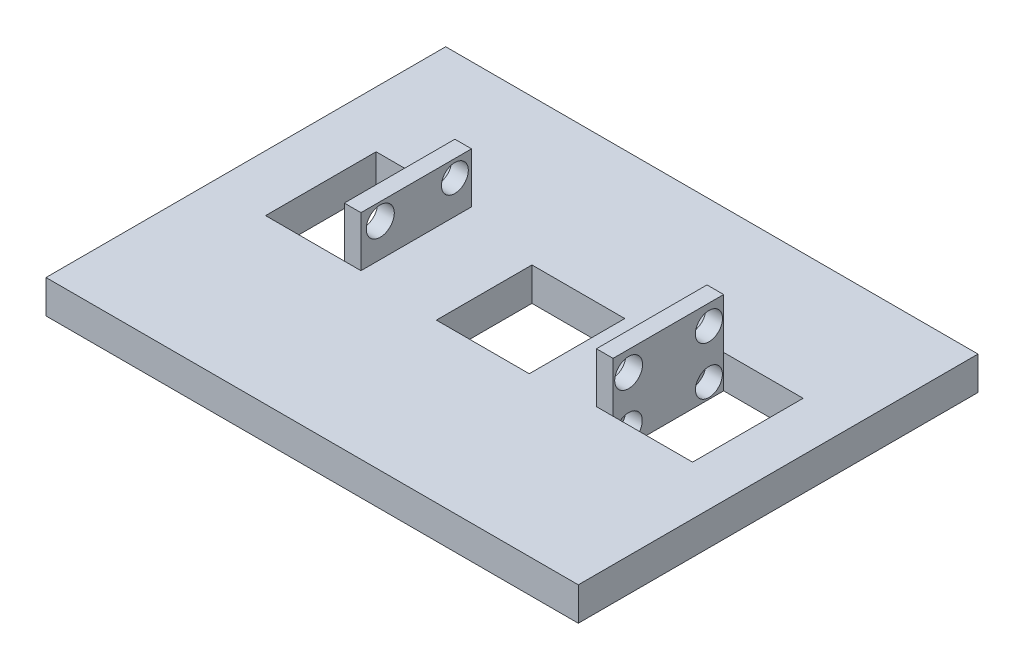
ISO-10303-21;
HEADER;
FILE_DESCRIPTION(('STEP AP214'),'2;1');
FILE_NAME('part.step','',(''),(''),'','','');
FILE_SCHEMA(('AUTOMOTIVE_DESIGN { 1 0 10303 214 1 1 1 1 }'));
ENDSEC;
DATA;
#1=APPLICATION_CONTEXT('core data for automotive mechanical design processes');
#2=APPLICATION_PROTOCOL_DEFINITION('international standard','automotive_design',2000,#1);
#3=PRODUCT_CONTEXT('',#1,'mechanical');
#4=PRODUCT('Part','Part','',(#3));
#5=PRODUCT_RELATED_PRODUCT_CATEGORY('part','',(#4));
#6=PRODUCT_DEFINITION_FORMATION('','',#4);
#7=PRODUCT_DEFINITION_CONTEXT('part definition',#1,'design');
#8=PRODUCT_DEFINITION('design','',#6,#7);
#9=PRODUCT_DEFINITION_SHAPE('','',#8);
#10=(LENGTH_UNIT() NAMED_UNIT(*) SI_UNIT(.MILLI.,.METRE.));
#11=(NAMED_UNIT(*) PLANE_ANGLE_UNIT() SI_UNIT($,.RADIAN.));
#12=(NAMED_UNIT(*) SI_UNIT($,.STERADIAN.) SOLID_ANGLE_UNIT());
#13=UNCERTAINTY_MEASURE_WITH_UNIT(LENGTH_MEASURE(1.E-05),#10,'distance_accuracy_value','');
#14=(GEOMETRIC_REPRESENTATION_CONTEXT(3) GLOBAL_UNCERTAINTY_ASSIGNED_CONTEXT((#13)) GLOBAL_UNIT_ASSIGNED_CONTEXT((#10,
#11,#12)) REPRESENTATION_CONTEXT('',''));
#15=CARTESIAN_POINT('',(0.,0.,0.));
#16=DIRECTION('',(0.,0.,1.));
#17=DIRECTION('',(1.,0.,0.));
#18=AXIS2_PLACEMENT_3D('',#15,#16,#17);
#19=CARTESIAN_POINT('',(77.3046626607348,0.,0.));
#20=DIRECTION('',(0.,0.,-1.));
#21=DIRECTION('',(-1.,0.,0.));
#22=AXIS2_PLACEMENT_3D('',#19,#20,#21);
#23=PLANE('',#22);
#24=DIRECTION('',(0.,1.,0.));
#25=VECTOR('',#24,1.);
#26=CARTESIAN_POINT('',(75.6896038656388,25.0562138380133,0.));
#27=LINE('',#26,#25);
#28=CARTESIAN_POINT('',(75.6896038656388,0.,0.));
#29=VERTEX_POINT('',#28);
#30=CARTESIAN_POINT('',(75.6896038656388,10.,0.));
#31=VERTEX_POINT('',#30);
#32=EDGE_CURVE('E193',#29,#31,#27,.T.);
#33=ORIENTED_EDGE('',*,*,#32,.F.);
#34=DIRECTION('',(1.,0.,0.));
#35=VECTOR('',#34,1.);
#36=CARTESIAN_POINT('',(77.3046626607348,0.,0.));
#37=LINE('',#36,#35);
#38=CARTESIAN_POINT('',(99.5486784733164,0.,0.));
#39=VERTEX_POINT('',#38);
#40=EDGE_CURVE('E203',#29,#39,#37,.T.);
#41=ORIENTED_EDGE('',*,*,#40,.T.);
#42=DIRECTION('',(0.,1.,0.));
#43=VECTOR('',#42,1.);
#44=CARTESIAN_POINT('',(99.5486784733164,0.,0.));
#45=LINE('',#44,#43);
#46=CARTESIAN_POINT('',(99.5486784733164,10.,0.));
#47=VERTEX_POINT('',#46);
#48=EDGE_CURVE('E222',#39,#47,#45,.T.);
#49=ORIENTED_EDGE('',*,*,#48,.T.);
#50=DIRECTION('',(-1.,0.,0.));
#51=VECTOR('',#50,1.);
#52=CARTESIAN_POINT('',(77.3046626607348,10.,0.));
#53=LINE('',#52,#51);
#54=EDGE_CURVE('E206',#47,#31,#53,.T.);
#55=ORIENTED_EDGE('',*,*,#54,.T.);
#56=EDGE_LOOP('',(#33,#41,#49,#55));
#57=FACE_BOUND('',#56,.T.);
#58=ADVANCED_FACE('F39',(#57),#23,.F.);
#59=CARTESIAN_POINT('',(99.5486784733164,0.,33.1965323237418));
#60=DIRECTION('',(0.,0.,-1.));
#61=DIRECTION('',(-1.,0.,0.));
#62=AXIS2_PLACEMENT_3D('',#59,#60,#61);
#63=PLANE('',#62);
#64=DIRECTION('',(1.,0.,0.));
#65=VECTOR('',#64,1.);
#66=CARTESIAN_POINT('',(70.6896038656388,0.,33.1965323237418));
#67=LINE('',#66,#65);
#68=CARTESIAN_POINT('',(75.6896038656388,0.,33.1965323237418));
#69=VERTEX_POINT('',#68);
#70=CARTESIAN_POINT('',(99.5486784733164,0.,33.1965323237418));
#71=VERTEX_POINT('',#70);
#72=EDGE_CURVE('E220',#69,#71,#67,.T.);
#73=ORIENTED_EDGE('',*,*,#72,.F.);
#74=DIRECTION('',(0.,1.,0.));
#75=VECTOR('',#74,1.);
#76=CARTESIAN_POINT('',(75.6896038656388,0.,33.1965323237418));
#77=LINE('',#76,#75);
#78=CARTESIAN_POINT('',(75.6896038656388,10.,33.1965323237418));
#79=VERTEX_POINT('',#78);
#80=EDGE_CURVE('E11',#69,#79,#77,.T.);
#81=ORIENTED_EDGE('',*,*,#80,.T.);
#82=DIRECTION('',(-1.,0.,0.));
#83=VECTOR('',#82,1.);
#84=CARTESIAN_POINT('',(99.5486784733164,10.,33.1965323237418));
#85=LINE('',#84,#83);
#86=CARTESIAN_POINT('',(99.5486784733164,10.,33.1965323237418));
#87=VERTEX_POINT('',#86);
#88=EDGE_CURVE('E613',#87,#79,#85,.T.);
#89=ORIENTED_EDGE('',*,*,#88,.F.);
#90=DIRECTION('',(0.,1.,0.));
#91=VECTOR('',#90,1.);
#92=CARTESIAN_POINT('',(99.5486784733164,0.,33.1965323237418));
#93=LINE('',#92,#91);
#94=EDGE_CURVE('E216',#71,#87,#93,.T.);
#95=ORIENTED_EDGE('',*,*,#94,.F.);
#96=EDGE_LOOP('',(#73,#81,#89,#95));
#97=FACE_BOUND('',#96,.T.);
#98=ADVANCED_FACE('F349',(#97),#63,.T.);
#99=CARTESIAN_POINT('',(0.,0.,0.));
#100=DIRECTION('',(0.,0.,-1.));
#101=DIRECTION('',(-1.,0.,0.));
#102=AXIS2_PLACEMENT_3D('',#99,#100,#101);
#103=PLANE('',#102);
#104=DIRECTION('',(0.,-1.,0.));
#105=VECTOR('',#104,1.);
#106=CARTESIAN_POINT('',(-5.,0.,0.));
#107=LINE('',#106,#105);
#108=CARTESIAN_POINT('',(-5.,10.,0.));
#109=VERTEX_POINT('',#108);
#110=CARTESIAN_POINT('',(-5.,0.,0.));
#111=VERTEX_POINT('',#110);
#112=EDGE_CURVE('E553',#109,#111,#107,.T.);
#113=ORIENTED_EDGE('',*,*,#112,.F.);
#114=DIRECTION('',(-1.,0.,0.));
#115=VECTOR('',#114,1.);
#116=CARTESIAN_POINT('',(0.,10.,0.));
#117=LINE('',#116,#115);
#118=CARTESIAN_POINT('',(-28.6462641466174,10.,0.));
#119=VERTEX_POINT('',#118);
#120=EDGE_CURVE('E590',#109,#119,#117,.T.);
#121=ORIENTED_EDGE('',*,*,#120,.T.);
#122=DIRECTION('',(0.,1.,0.));
#123=VECTOR('',#122,1.);
#124=CARTESIAN_POINT('',(-28.6462641466174,0.,0.));
#125=LINE('',#124,#123);
#126=CARTESIAN_POINT('',(-28.6462641466174,0.,0.));
#127=VERTEX_POINT('',#126);
#128=EDGE_CURVE('E236',#127,#119,#125,.T.);
#129=ORIENTED_EDGE('',*,*,#128,.F.);
#130=DIRECTION('',(1.,0.,0.));
#131=VECTOR('',#130,1.);
#132=CARTESIAN_POINT('',(-28.6462641466174,0.,0.));
#133=LINE('',#132,#131);
#134=EDGE_CURVE('E577',#127,#111,#133,.T.);
#135=ORIENTED_EDGE('',*,*,#134,.T.);
#136=EDGE_LOOP('',(#113,#121,#129,#135));
#137=FACE_BOUND('',#136,.T.);
#138=ADVANCED_FACE('F353',(#137),#103,.F.);
#139=CARTESIAN_POINT('',(-6.40351999211286,0.,33.1965323237418));
#140=DIRECTION('',(0.,0.,-1.));
#141=DIRECTION('',(-1.,0.,0.));
#142=AXIS2_PLACEMENT_3D('',#139,#140,#141);
#143=PLANE('',#142);
#144=DIRECTION('',(-1.,0.,0.));
#145=VECTOR('',#144,1.);
#146=CARTESIAN_POINT('',(-6.40351999211286,10.,33.1965323237418));
#147=LINE('',#146,#145);
#148=CARTESIAN_POINT('',(-5.,10.,33.1965323237418));
#149=VERTEX_POINT('',#148);
#150=CARTESIAN_POINT('',(-28.6462641466174,10.,33.1965323237418));
#151=VERTEX_POINT('',#150);
#152=EDGE_CURVE('E63',#149,#151,#147,.T.);
#153=ORIENTED_EDGE('',*,*,#152,.F.);
#154=DIRECTION('',(0.,1.,0.));
#155=VECTOR('',#154,1.);
#156=CARTESIAN_POINT('',(-5.,22.4657523322094,33.1965323237418));
#157=LINE('',#156,#155);
#158=CARTESIAN_POINT('',(-5.,0.,33.1965323237418));
#159=VERTEX_POINT('',#158);
#160=EDGE_CURVE('E546',#159,#149,#157,.T.);
#161=ORIENTED_EDGE('',*,*,#160,.F.);
#162=DIRECTION('',(1.,0.,0.));
#163=VECTOR('',#162,1.);
#164=CARTESIAN_POINT('',(-6.40351999211286,0.,33.1965323237418));
#165=LINE('',#164,#163);
#166=CARTESIAN_POINT('',(-28.6462641466174,0.,33.1965323237418));
#167=VERTEX_POINT('',#166);
#168=EDGE_CURVE('E582',#167,#159,#165,.T.);
#169=ORIENTED_EDGE('',*,*,#168,.F.);
#170=DIRECTION('',(0.,1.,0.));
#171=VECTOR('',#170,1.);
#172=CARTESIAN_POINT('',(-28.6462641466174,0.,33.1965323237418));
#173=LINE('',#172,#171);
#174=EDGE_CURVE('E586',#167,#151,#173,.T.);
#175=ORIENTED_EDGE('',*,*,#174,.T.);
#176=EDGE_LOOP('',(#153,#161,#169,#175));
#177=FACE_BOUND('',#176,.T.);
#178=ADVANCED_FACE('F368',(#177),#143,.T.);
#179=CARTESIAN_POINT('',(0.,10.,0.));
#180=DIRECTION('',(0.,1.,0.));
#181=DIRECTION('',(0.,0.,1.));
#182=AXIS2_PLACEMENT_3D('',#179,#180,#181);
#183=PLANE('',#182);
#184=DIRECTION('',(1.,0.,0.));
#185=VECTOR('',#184,1.);
#186=CARTESIAN_POINT('',(24.1652876550198,10.,6.03100491844726));
#187=LINE('',#186,#185);
#188=CARTESIAN_POINT('',(24.1652876550198,10.,6.03100491844726));
#189=VERTEX_POINT('',#188);
#190=CARTESIAN_POINT('',(52.0481990577544,10.,6.03100491844726));
#191=VERTEX_POINT('',#190);
#192=EDGE_CURVE('E244',#189,#191,#187,.T.);
#193=ORIENTED_EDGE('',*,*,#192,.T.);
#194=DIRECTION('',(0.,0.,1.));
#195=VECTOR('',#194,1.);
#196=CARTESIAN_POINT('',(52.0481990577544,10.,16.0059569402772));
#197=LINE('',#196,#195);
#198=CARTESIAN_POINT('',(52.0481990577544,10.,34.7216767180942));
#199=VERTEX_POINT('',#198);
#200=EDGE_CURVE('E231',#191,#199,#197,.T.);
#201=ORIENTED_EDGE('',*,*,#200,.T.);
#202=DIRECTION('',(-1.,0.,0.));
#203=VECTOR('',#202,1.);
#204=CARTESIAN_POINT('',(52.0481990577544,10.,34.7216767180942));
#205=LINE('',#204,#203);
#206=CARTESIAN_POINT('',(24.1652876550198,10.,34.7216767180942));
#207=VERTEX_POINT('',#206);
#208=EDGE_CURVE('E235',#199,#207,#205,.T.);
#209=ORIENTED_EDGE('',*,*,#208,.T.);
#210=DIRECTION('',(0.,0.,-1.));
#211=VECTOR('',#210,1.);
#212=CARTESIAN_POINT('',(24.1652876550198,10.,34.7216767180942));
#213=LINE('',#212,#211);
#214=EDGE_CURVE('E240',#207,#189,#213,.T.);
#215=ORIENTED_EDGE('',*,*,#214,.T.);
#216=EDGE_LOOP('',(#193,#201,#209,#215));
#217=FACE_BOUND('',#216,.T.);
#218=DIRECTION('',(0.,0.,-1.));
#219=VECTOR('',#218,1.);
#220=CARTESIAN_POINT('',(114.292682926829,10.,82.2439024390244));
#221=LINE('',#220,#219);
#222=CARTESIAN_POINT('',(114.292682926829,10.,82.2439024390244));
#223=VERTEX_POINT('',#222);
#224=CARTESIAN_POINT('',(114.292682926829,10.,-37.7560975609756));
#225=VERTEX_POINT('',#224);
#226=EDGE_CURVE('E262',#223,#225,#221,.T.);
#227=ORIENTED_EDGE('',*,*,#226,.T.);
#228=DIRECTION('',(-1.,0.,0.));
#229=VECTOR('',#228,1.);
#230=CARTESIAN_POINT('',(114.292682926829,10.,-37.7560975609756));
#231=LINE('',#230,#229);
#232=CARTESIAN_POINT('',(-45.5121951219512,10.,-37.7560975609756));
#233=VERTEX_POINT('',#232);
#234=EDGE_CURVE('E266',#225,#233,#231,.T.);
#235=ORIENTED_EDGE('',*,*,#234,.T.);
#236=DIRECTION('',(0.,0.,1.));
#237=VECTOR('',#236,1.);
#238=CARTESIAN_POINT('',(-45.5121951219512,10.,-37.7560975609756));
#239=LINE('',#238,#237);
#240=CARTESIAN_POINT('',(-45.5121951219512,10.,82.2439024390244));
#241=VERTEX_POINT('',#240);
#242=EDGE_CURVE('E270',#233,#241,#239,.T.);
#243=ORIENTED_EDGE('',*,*,#242,.T.);
#244=DIRECTION('',(1.,0.,0.));
#245=VECTOR('',#244,1.);
#246=CARTESIAN_POINT('',(-45.5121951219512,10.,82.2439024390244));
#247=LINE('',#246,#245);
#248=EDGE_CURVE('E273',#241,#223,#247,.T.);
#249=ORIENTED_EDGE('',*,*,#248,.T.);
#250=EDGE_LOOP('',(#227,#235,#243,#249));
#251=FACE_BOUND('',#250,.T.);
#252=DIRECTION('',(0.,0.,1.));
#253=VECTOR('',#252,1.);
#254=CARTESIAN_POINT('',(70.6896038656388,10.,0.));
#255=LINE('',#254,#253);
#256=CARTESIAN_POINT('',(70.6896038656388,10.,0.));
#257=VERTEX_POINT('',#256);
#258=CARTESIAN_POINT('',(70.6896038656388,10.,33.1965323237418));
#259=VERTEX_POINT('',#258);
#260=EDGE_CURVE('E225',#257,#259,#255,.T.);
#261=ORIENTED_EDGE('',*,*,#260,.F.);
#262=EDGE_CURVE('E230',#31,#257,#53,.T.);
#263=ORIENTED_EDGE('',*,*,#262,.F.);
#264=ORIENTED_EDGE('',*,*,#54,.F.);
#265=DIRECTION('',(0.,0.,1.));
#266=VECTOR('',#265,1.);
#267=CARTESIAN_POINT('',(99.5486784733164,10.,0.));
#268=LINE('',#267,#266);
#269=EDGE_CURVE('E609',#47,#87,#268,.T.);
#270=ORIENTED_EDGE('',*,*,#269,.T.);
#271=ORIENTED_EDGE('',*,*,#88,.T.);
#272=EDGE_CURVE('E612',#79,#259,#85,.T.);
#273=ORIENTED_EDGE('',*,*,#272,.T.);
#274=EDGE_LOOP('',(#261,#263,#264,#270,#271,#273));
#275=FACE_BOUND('',#274,.T.);
#276=CARTESIAN_POINT('',(0.,10.,33.1965323237418));
#277=VERTEX_POINT('',#276);
#278=EDGE_CURVE('E578',#277,#149,#147,.T.);
#279=ORIENTED_EDGE('',*,*,#278,.T.);
#280=ORIENTED_EDGE('',*,*,#152,.T.);
#281=DIRECTION('',(0.,0.,-1.));
#282=VECTOR('',#281,1.);
#283=CARTESIAN_POINT('',(-28.6462641466174,10.,33.1965323237418));
#284=LINE('',#283,#282);
#285=EDGE_CURVE('E587',#151,#119,#284,.T.);
#286=ORIENTED_EDGE('',*,*,#285,.T.);
#287=ORIENTED_EDGE('',*,*,#120,.F.);
#288=CARTESIAN_POINT('',(0.,10.,0.));
#289=VERTEX_POINT('',#288);
#290=EDGE_CURVE('E591',#289,#109,#117,.T.);
#291=ORIENTED_EDGE('',*,*,#290,.F.);
#292=DIRECTION('',(0.,0.,-1.));
#293=VECTOR('',#292,1.);
#294=CARTESIAN_POINT('',(0.,10.,33.1965323237418));
#295=LINE('',#294,#293);
#296=EDGE_CURVE('E594',#277,#289,#295,.T.);
#297=ORIENTED_EDGE('',*,*,#296,.F.);
#298=EDGE_LOOP('',(#279,#280,#286,#287,#291,#297));
#299=FACE_BOUND('',#298,.T.);
#300=ADVANCED_FACE('F332',(#217,#251,#275,#299),#183,.T.);
#301=CARTESIAN_POINT('',(0.,0.,0.));
#302=DIRECTION('',(0.,1.,0.));
#303=DIRECTION('',(0.,0.,1.));
#304=AXIS2_PLACEMENT_3D('',#301,#302,#303);
#305=PLANE('',#304);
#306=ORIENTED_EDGE('',*,*,#40,.F.);
#307=DIRECTION('',(0.,0.,-1.));
#308=VECTOR('',#307,1.);
#309=CARTESIAN_POINT('',(75.6896038656388,0.,0.));
#310=LINE('',#309,#308);
#311=EDGE_CURVE('E55',#69,#29,#310,.T.);
#312=ORIENTED_EDGE('',*,*,#311,.F.);
#313=ORIENTED_EDGE('',*,*,#72,.T.);
#314=DIRECTION('',(0.,0.,1.));
#315=VECTOR('',#314,1.);
#316=CARTESIAN_POINT('',(99.5486784733164,0.,0.));
#317=LINE('',#316,#315);
#318=EDGE_CURVE('E214',#39,#71,#317,.T.);
#319=ORIENTED_EDGE('',*,*,#318,.F.);
#320=EDGE_LOOP('',(#306,#312,#313,#319));
#321=FACE_BOUND('',#320,.T.);
#322=DIRECTION('',(0.,0.,1.));
#323=VECTOR('',#322,1.);
#324=CARTESIAN_POINT('',(-5.,0.,33.1965323237418));
#325=LINE('',#324,#323);
#326=EDGE_CURVE('E541',#111,#159,#325,.T.);
#327=ORIENTED_EDGE('',*,*,#326,.F.);
#328=ORIENTED_EDGE('',*,*,#134,.F.);
#329=DIRECTION('',(0.,0.,-1.));
#330=VECTOR('',#329,1.);
#331=CARTESIAN_POINT('',(-28.6462641466174,0.,33.1965323237418));
#332=LINE('',#331,#330);
#333=EDGE_CURVE('E574',#167,#127,#332,.T.);
#334=ORIENTED_EDGE('',*,*,#333,.F.);
#335=ORIENTED_EDGE('',*,*,#168,.T.);
#336=EDGE_LOOP('',(#327,#328,#334,#335));
#337=FACE_BOUND('',#336,.T.);
#338=DIRECTION('',(0.,0.,1.));
#339=VECTOR('',#338,1.);
#340=CARTESIAN_POINT('',(52.0481990577544,0.,0.));
#341=LINE('',#340,#339);
#342=CARTESIAN_POINT('',(52.0481990577544,0.,6.03100491844726));
#343=VERTEX_POINT('',#342);
#344=CARTESIAN_POINT('',(52.0481990577544,0.,34.7216767180942));
#345=VERTEX_POINT('',#344);
#346=EDGE_CURVE('E48',#343,#345,#341,.T.);
#347=ORIENTED_EDGE('',*,*,#346,.F.);
#348=DIRECTION('',(1.,0.,0.));
#349=VECTOR('',#348,1.);
#350=CARTESIAN_POINT('',(0.,0.,6.03100491844726));
#351=LINE('',#350,#349);
#352=CARTESIAN_POINT('',(24.1652876550198,0.,6.03100491844726));
#353=VERTEX_POINT('',#352);
#354=EDGE_CURVE('E303',#353,#343,#351,.T.);
#355=ORIENTED_EDGE('',*,*,#354,.F.);
#356=DIRECTION('',(0.,0.,-1.));
#357=VECTOR('',#356,1.);
#358=CARTESIAN_POINT('',(24.1652876550198,0.,0.));
#359=LINE('',#358,#357);
#360=CARTESIAN_POINT('',(24.1652876550198,0.,34.7216767180942));
#361=VERTEX_POINT('',#360);
#362=EDGE_CURVE('E306',#361,#353,#359,.T.);
#363=ORIENTED_EDGE('',*,*,#362,.F.);
#364=DIRECTION('',(-1.,0.,0.));
#365=VECTOR('',#364,1.);
#366=CARTESIAN_POINT('',(0.,0.,34.7216767180942));
#367=LINE('',#366,#365);
#368=EDGE_CURVE('E310',#345,#361,#367,.T.);
#369=ORIENTED_EDGE('',*,*,#368,.F.);
#370=EDGE_LOOP('',(#347,#355,#363,#369));
#371=FACE_BOUND('',#370,.T.);
#372=DIRECTION('',(0.,0.,-1.));
#373=VECTOR('',#372,1.);
#374=CARTESIAN_POINT('',(114.292682926829,0.,82.2439024390244));
#375=LINE('',#374,#373);
#376=CARTESIAN_POINT('',(114.292682926829,0.,82.2439024390244));
#377=VERTEX_POINT('',#376);
#378=CARTESIAN_POINT('',(114.292682926829,0.,-37.7560975609756));
#379=VERTEX_POINT('',#378);
#380=EDGE_CURVE('E261',#377,#379,#375,.T.);
#381=ORIENTED_EDGE('',*,*,#380,.F.);
#382=DIRECTION('',(1.,0.,0.));
#383=VECTOR('',#382,1.);
#384=CARTESIAN_POINT('',(-45.5121951219512,0.,82.2439024390244));
#385=LINE('',#384,#383);
#386=CARTESIAN_POINT('',(-45.5121951219512,0.,82.2439024390244));
#387=VERTEX_POINT('',#386);
#388=EDGE_CURVE('E267',#387,#377,#385,.T.);
#389=ORIENTED_EDGE('',*,*,#388,.F.);
#390=DIRECTION('',(0.,0.,1.));
#391=VECTOR('',#390,1.);
#392=CARTESIAN_POINT('',(-45.5121951219512,0.,-37.7560975609756));
#393=LINE('',#392,#391);
#394=CARTESIAN_POINT('',(-45.5121951219512,0.,-37.7560975609756));
#395=VERTEX_POINT('',#394);
#396=EDGE_CURVE('E283',#395,#387,#393,.T.);
#397=ORIENTED_EDGE('',*,*,#396,.F.);
#398=DIRECTION('',(-1.,0.,0.));
#399=VECTOR('',#398,1.);
#400=CARTESIAN_POINT('',(114.292682926829,0.,-37.7560975609756));
#401=LINE('',#400,#399);
#402=EDGE_CURVE('E280',#379,#395,#401,.T.);
#403=ORIENTED_EDGE('',*,*,#402,.F.);
#404=EDGE_LOOP('',(#381,#389,#397,#403));
#405=FACE_BOUND('',#404,.T.);
#406=ADVANCED_FACE('F211',(#321,#337,#371,#405),#305,.F.);
#407=CARTESIAN_POINT('',(114.292682926829,10.,82.2439024390244));
#408=DIRECTION('',(-1.,0.,0.));
#409=DIRECTION('',(0.,0.,1.));
#410=AXIS2_PLACEMENT_3D('',#407,#408,#409);
#411=PLANE('',#410);
#412=ORIENTED_EDGE('',*,*,#380,.T.);
#413=DIRECTION('',(0.,-1.,0.));
#414=VECTOR('',#413,1.);
#415=CARTESIAN_POINT('',(114.292682926829,10.,-37.7560975609756));
#416=LINE('',#415,#414);
#417=EDGE_CURVE('E299',#225,#379,#416,.T.);
#418=ORIENTED_EDGE('',*,*,#417,.F.);
#419=ORIENTED_EDGE('',*,*,#226,.F.);
#420=DIRECTION('',(0.,-1.,0.));
#421=VECTOR('',#420,1.);
#422=CARTESIAN_POINT('',(114.292682926829,10.,82.2439024390244));
#423=LINE('',#422,#421);
#424=EDGE_CURVE('E276',#223,#377,#423,.T.);
#425=ORIENTED_EDGE('',*,*,#424,.T.);
#426=EDGE_LOOP('',(#412,#418,#419,#425));
#427=FACE_BOUND('',#426,.T.);
#428=ADVANCED_FACE('F41',(#427),#411,.F.);
#429=CARTESIAN_POINT('',(114.292682926829,10.,-37.7560975609756));
#430=DIRECTION('',(0.,0.,1.));
#431=DIRECTION('',(1.,0.,0.));
#432=AXIS2_PLACEMENT_3D('',#429,#430,#431);
#433=PLANE('',#432);
#434=ORIENTED_EDGE('',*,*,#402,.T.);
#435=DIRECTION('',(0.,-1.,0.));
#436=VECTOR('',#435,1.);
#437=CARTESIAN_POINT('',(-45.5121951219512,10.,-37.7560975609756));
#438=LINE('',#437,#436);
#439=EDGE_CURVE('E295',#233,#395,#438,.T.);
#440=ORIENTED_EDGE('',*,*,#439,.F.);
#441=ORIENTED_EDGE('',*,*,#234,.F.);
#442=ORIENTED_EDGE('',*,*,#417,.T.);
#443=EDGE_LOOP('',(#434,#440,#441,#442));
#444=FACE_BOUND('',#443,.T.);
#445=ADVANCED_FACE('F678',(#444),#433,.F.);
#446=CARTESIAN_POINT('',(-45.5121951219512,10.,-37.7560975609756));
#447=DIRECTION('',(1.,0.,0.));
#448=DIRECTION('',(0.,0.,-1.));
#449=AXIS2_PLACEMENT_3D('',#446,#447,#448);
#450=PLANE('',#449);
#451=ORIENTED_EDGE('',*,*,#396,.T.);
#452=DIRECTION('',(0.,-1.,0.));
#453=VECTOR('',#452,1.);
#454=CARTESIAN_POINT('',(-45.5121951219512,10.,82.2439024390244));
#455=LINE('',#454,#453);
#456=EDGE_CURVE('E291',#241,#387,#455,.T.);
#457=ORIENTED_EDGE('',*,*,#456,.F.);
#458=ORIENTED_EDGE('',*,*,#242,.F.);
#459=ORIENTED_EDGE('',*,*,#439,.T.);
#460=EDGE_LOOP('',(#451,#457,#458,#459));
#461=FACE_BOUND('',#460,.T.);
#462=ADVANCED_FACE('F675',(#461),#450,.F.);
#463=CARTESIAN_POINT('',(-45.5121951219512,10.,82.2439024390244));
#464=DIRECTION('',(0.,0.,-1.));
#465=DIRECTION('',(-1.,0.,0.));
#466=AXIS2_PLACEMENT_3D('',#463,#464,#465);
#467=PLANE('',#466);
#468=ORIENTED_EDGE('',*,*,#388,.T.);
#469=ORIENTED_EDGE('',*,*,#424,.F.);
#470=ORIENTED_EDGE('',*,*,#248,.F.);
#471=ORIENTED_EDGE('',*,*,#456,.T.);
#472=EDGE_LOOP('',(#468,#469,#470,#471));
#473=FACE_BOUND('',#472,.T.);
#474=ADVANCED_FACE('F672',(#473),#467,.F.);
#475=CARTESIAN_POINT('',(52.0481990577544,-10.,16.0059569402772));
#476=DIRECTION('',(-1.,0.,0.));
#477=DIRECTION('',(0.,0.,1.));
#478=AXIS2_PLACEMENT_3D('',#475,#476,#477);
#479=PLANE('',#478);
#480=ORIENTED_EDGE('',*,*,#346,.T.);
#481=DIRECTION('',(0.,1.,0.));
#482=VECTOR('',#481,1.);
#483=CARTESIAN_POINT('',(52.0481990577544,-10.,34.7216767180942));
#484=LINE('',#483,#482);
#485=EDGE_CURVE('E258',#345,#199,#484,.T.);
#486=ORIENTED_EDGE('',*,*,#485,.T.);
#487=ORIENTED_EDGE('',*,*,#200,.F.);
#488=DIRECTION('',(0.,1.,0.));
#489=VECTOR('',#488,1.);
#490=CARTESIAN_POINT('',(52.0481990577544,-10.,6.03100491844726));
#491=LINE('',#490,#489);
#492=EDGE_CURVE('E248',#343,#191,#491,.T.);
#493=ORIENTED_EDGE('',*,*,#492,.F.);
#494=EDGE_LOOP('',(#480,#486,#487,#493));
#495=FACE_BOUND('',#494,.T.);
#496=ADVANCED_FACE('F317',(#495),#479,.T.);
#497=CARTESIAN_POINT('',(52.0481990577544,-10.,34.7216767180942));
#498=DIRECTION('',(0.,0.,-1.));
#499=DIRECTION('',(-1.,0.,0.));
#500=AXIS2_PLACEMENT_3D('',#497,#498,#499);
#501=PLANE('',#500);
#502=ORIENTED_EDGE('',*,*,#368,.T.);
#503=DIRECTION('',(0.,1.,0.));
#504=VECTOR('',#503,1.);
#505=CARTESIAN_POINT('',(24.1652876550198,-10.,34.7216767180942));
#506=LINE('',#505,#504);
#507=EDGE_CURVE('E255',#361,#207,#506,.T.);
#508=ORIENTED_EDGE('',*,*,#507,.T.);
#509=ORIENTED_EDGE('',*,*,#208,.F.);
#510=ORIENTED_EDGE('',*,*,#485,.F.);
#511=EDGE_LOOP('',(#502,#508,#509,#510));
#512=FACE_BOUND('',#511,.T.);
#513=ADVANCED_FACE('F323',(#512),#501,.T.);
#514=CARTESIAN_POINT('',(24.1652876550198,-10.,34.7216767180942));
#515=DIRECTION('',(1.,0.,0.));
#516=DIRECTION('',(0.,0.,-1.));
#517=AXIS2_PLACEMENT_3D('',#514,#515,#516);
#518=PLANE('',#517);
#519=ORIENTED_EDGE('',*,*,#362,.T.);
#520=DIRECTION('',(0.,1.,0.));
#521=VECTOR('',#520,1.);
#522=CARTESIAN_POINT('',(24.1652876550198,-10.,6.03100491844726));
#523=LINE('',#522,#521);
#524=EDGE_CURVE('E252',#353,#189,#523,.T.);
#525=ORIENTED_EDGE('',*,*,#524,.T.);
#526=ORIENTED_EDGE('',*,*,#214,.F.);
#527=ORIENTED_EDGE('',*,*,#507,.F.);
#528=EDGE_LOOP('',(#519,#525,#526,#527));
#529=FACE_BOUND('',#528,.T.);
#530=ADVANCED_FACE('F328',(#529),#518,.T.);
#531=CARTESIAN_POINT('',(24.1652876550198,-10.,6.03100491844726));
#532=DIRECTION('',(0.,0.,1.));
#533=DIRECTION('',(1.,0.,0.));
#534=AXIS2_PLACEMENT_3D('',#531,#532,#533);
#535=PLANE('',#534);
#536=ORIENTED_EDGE('',*,*,#354,.T.);
#537=ORIENTED_EDGE('',*,*,#492,.T.);
#538=ORIENTED_EDGE('',*,*,#192,.F.);
#539=ORIENTED_EDGE('',*,*,#524,.F.);
#540=EDGE_LOOP('',(#536,#537,#538,#539));
#541=FACE_BOUND('',#540,.T.);
#542=ADVANCED_FACE('F335',(#541),#535,.T.);
#543=CARTESIAN_POINT('',(99.5486784733164,0.,0.));
#544=DIRECTION('',(-1.,0.,0.));
#545=DIRECTION('',(0.,0.,1.));
#546=AXIS2_PLACEMENT_3D('',#543,#544,#545);
#547=PLANE('',#546);
#548=ORIENTED_EDGE('',*,*,#269,.F.);
#549=ORIENTED_EDGE('',*,*,#48,.F.);
#550=ORIENTED_EDGE('',*,*,#318,.T.);
#551=ORIENTED_EDGE('',*,*,#94,.T.);
#552=EDGE_LOOP('',(#548,#549,#550,#551));
#553=FACE_BOUND('',#552,.T.);
#554=ADVANCED_FACE('F337',(#553),#547,.T.);
#555=CARTESIAN_POINT('',(-28.6462641466174,0.,33.1965323237418));
#556=DIRECTION('',(1.,0.,0.));
#557=DIRECTION('',(0.,0.,-1.));
#558=AXIS2_PLACEMENT_3D('',#555,#556,#557);
#559=PLANE('',#558);
#560=ORIENTED_EDGE('',*,*,#285,.F.);
#561=ORIENTED_EDGE('',*,*,#174,.F.);
#562=ORIENTED_EDGE('',*,*,#333,.T.);
#563=ORIENTED_EDGE('',*,*,#128,.T.);
#564=EDGE_LOOP('',(#560,#561,#562,#563));
#565=FACE_BOUND('',#564,.T.);
#566=ADVANCED_FACE('F343',(#565),#559,.T.);
#567=CARTESIAN_POINT('',(-5.,0.,0.));
#568=DIRECTION('',(1.,0.,0.));
#569=DIRECTION('',(0.,0.,-1.));
#570=AXIS2_PLACEMENT_3D('',#567,#568,#569);
#571=PLANE('',#570);
#572=ORIENTED_EDGE('',*,*,#326,.T.);
#573=ORIENTED_EDGE('',*,*,#160,.T.);
#574=CARTESIAN_POINT('',(-5.,25.0892259815885,33.1965323237418));
#575=VERTEX_POINT('',#574);
#576=EDGE_CURVE('E544',#149,#575,#157,.T.);
#577=ORIENTED_EDGE('',*,*,#576,.T.);
#578=DIRECTION('',(0.,0.,-1.));
#579=VECTOR('',#578,1.);
#580=CARTESIAN_POINT('',(-5.,25.0892259815885,0.));
#581=LINE('',#580,#579);
#582=CARTESIAN_POINT('',(-5.,25.0892259815885,0.));
#583=VERTEX_POINT('',#582);
#584=EDGE_CURVE('E550',#575,#583,#581,.T.);
#585=ORIENTED_EDGE('',*,*,#584,.T.);
#586=EDGE_CURVE('E554',#583,#109,#107,.T.);
#587=ORIENTED_EDGE('',*,*,#586,.T.);
#588=ORIENTED_EDGE('',*,*,#112,.T.);
#589=EDGE_LOOP('',(#572,#573,#577,#585,#587,#588));
#590=FACE_BOUND('',#589,.T.);
#591=CARTESIAN_POINT('',(-5.,20.0097723265387,4.99932875840892));
#592=DIRECTION('',(-1.,0.,0.));
#593=DIRECTION('',(0.,0.,1.));
#594=AXIS2_PLACEMENT_3D('',#591,#592,#593);
#595=CIRCLE('',#594,4.02738609470973);
#596=CARTESIAN_POINT('',(-5.,20.0097723265387,9.02671485311864));
#597=VERTEX_POINT('',#596);
#598=EDGE_CURVE('E533',#597,#597,#595,.T.);
#599=ORIENTED_EDGE('',*,*,#598,.F.);
#600=EDGE_LOOP('',(#599));
#601=FACE_BOUND('',#600,.T.);
#602=CARTESIAN_POINT('',(-5.,20.0097723265387,27.4008713654246));
#603=DIRECTION('',(-1.,0.,0.));
#604=DIRECTION('',(0.,0.,1.));
#605=AXIS2_PLACEMENT_3D('',#602,#603,#604);
#606=CIRCLE('',#605,4.2056276541132);
#607=CARTESIAN_POINT('',(-5.,20.0097723265387,31.6064990195378));
#608=VERTEX_POINT('',#607);
#609=EDGE_CURVE('E525',#608,#608,#606,.T.);
#610=ORIENTED_EDGE('',*,*,#609,.F.);
#611=EDGE_LOOP('',(#610));
#612=FACE_BOUND('',#611,.T.);
#613=CARTESIAN_POINT('',(-5.,4.19367212560928,4.99932875840892));
#614=DIRECTION('',(-1.,0.,0.));
#615=DIRECTION('',(0.,0.,1.));
#616=AXIS2_PLACEMENT_3D('',#613,#614,#615);
#617=CIRCLE('',#616,4.03945698437636);
#618=CARTESIAN_POINT('',(-5.,4.19367212560928,9.03878574278528));
#619=VERTEX_POINT('',#618);
#620=EDGE_CURVE('E517',#619,#619,#617,.T.);
#621=ORIENTED_EDGE('',*,*,#620,.F.);
#622=EDGE_LOOP('',(#621));
#623=FACE_BOUND('',#622,.T.);
#624=CARTESIAN_POINT('',(-5.,4.19367212560928,27.4008713654246));
#625=DIRECTION('',(-1.,0.,0.));
#626=DIRECTION('',(0.,0.,1.));
#627=AXIS2_PLACEMENT_3D('',#624,#625,#626);
#628=CIRCLE('',#627,4.0361762375328);
#629=CARTESIAN_POINT('',(-5.,4.19367212560928,31.4370476029574));
#630=VERTEX_POINT('',#629);
#631=EDGE_CURVE('E509',#630,#630,#628,.T.);
#632=ORIENTED_EDGE('',*,*,#631,.F.);
#633=EDGE_LOOP('',(#632));
#634=FACE_BOUND('',#633,.T.);
#635=ADVANCED_FACE('F364',(#590,#601,#612,#623,#634),#571,.F.);
#636=CARTESIAN_POINT('',(0.,0.,0.));
#637=DIRECTION('',(1.,0.,0.));
#638=DIRECTION('',(0.,0.,-1.));
#639=AXIS2_PLACEMENT_3D('',#636,#637,#638);
#640=PLANE('',#639);
#641=CARTESIAN_POINT('',(0.,20.0097723265387,4.99932875840892));
#642=DIRECTION('',(-1.,0.,0.));
#643=DIRECTION('',(0.,0.,1.));
#644=AXIS2_PLACEMENT_3D('',#641,#642,#643);
#645=CIRCLE('',#644,4.02738609470973);
#646=CARTESIAN_POINT('',(0.,20.0097723265387,9.02671485311864));
#647=VERTEX_POINT('',#646);
#648=EDGE_CURVE('E529',#647,#647,#645,.T.);
#649=ORIENTED_EDGE('',*,*,#648,.T.);
#650=EDGE_LOOP('',(#649));
#651=FACE_BOUND('',#650,.T.);
#652=DIRECTION('',(0.,1.,0.));
#653=VECTOR('',#652,1.);
#654=CARTESIAN_POINT('',(0.,25.0892259815885,33.1965323237418));
#655=LINE('',#654,#653);
#656=CARTESIAN_POINT('',(0.,25.0892259815885,33.1965323237418));
#657=VERTEX_POINT('',#656);
#658=EDGE_CURVE('E537',#277,#657,#655,.T.);
#659=ORIENTED_EDGE('',*,*,#658,.F.);
#660=ORIENTED_EDGE('',*,*,#296,.T.);
#661=DIRECTION('',(0.,-1.,0.));
#662=VECTOR('',#661,1.);
#663=CARTESIAN_POINT('',(0.,0.,0.));
#664=LINE('',#663,#662);
#665=CARTESIAN_POINT('',(0.,25.0892259815885,0.));
#666=VERTEX_POINT('',#665);
#667=EDGE_CURVE('E545',#666,#289,#664,.T.);
#668=ORIENTED_EDGE('',*,*,#667,.F.);
#669=DIRECTION('',(0.,0.,-1.));
#670=VECTOR('',#669,1.);
#671=CARTESIAN_POINT('',(0.,25.0892259815885,0.));
#672=LINE('',#671,#670);
#673=EDGE_CURVE('E561',#657,#666,#672,.T.);
#674=ORIENTED_EDGE('',*,*,#673,.F.);
#675=EDGE_LOOP('',(#659,#660,#668,#674));
#676=FACE_BOUND('',#675,.T.);
#677=CARTESIAN_POINT('',(0.,20.0097723265387,27.4008713654246));
#678=DIRECTION('',(-1.,0.,0.));
#679=DIRECTION('',(0.,0.,1.));
#680=AXIS2_PLACEMENT_3D('',#677,#678,#679);
#681=CIRCLE('',#680,4.2056276541132);
#682=CARTESIAN_POINT('',(0.,20.0097723265387,31.6064990195378));
#683=VERTEX_POINT('',#682);
#684=EDGE_CURVE('E521',#683,#683,#681,.T.);
#685=ORIENTED_EDGE('',*,*,#684,.T.);
#686=EDGE_LOOP('',(#685));
#687=FACE_BOUND('',#686,.T.);
#688=ADVANCED_FACE('F382',(#651,#676,#687),#640,.T.);
#689=CARTESIAN_POINT('',(-5.,25.0892259815885,33.1965323237418));
#690=DIRECTION('',(0.,0.,-1.));
#691=DIRECTION('',(-1.,0.,0.));
#692=AXIS2_PLACEMENT_3D('',#689,#690,#691);
#693=PLANE('',#692);
#694=ORIENTED_EDGE('',*,*,#278,.F.);
#695=ORIENTED_EDGE('',*,*,#658,.T.);
#696=DIRECTION('',(1.,0.,0.));
#697=VECTOR('',#696,1.);
#698=CARTESIAN_POINT('',(-5.,25.0892259815885,33.1965323237418));
#699=LINE('',#698,#697);
#700=EDGE_CURVE('E570',#575,#657,#699,.T.);
#701=ORIENTED_EDGE('',*,*,#700,.F.);
#702=ORIENTED_EDGE('',*,*,#576,.F.);
#703=EDGE_LOOP('',(#694,#695,#701,#702));
#704=FACE_BOUND('',#703,.T.);
#705=ADVANCED_FACE('F378',(#704),#693,.F.);
#706=CARTESIAN_POINT('',(-5.,25.0892259815885,0.));
#707=DIRECTION('',(0.,-1.,0.));
#708=DIRECTION('',(0.,0.,-1.));
#709=AXIS2_PLACEMENT_3D('',#706,#707,#708);
#710=PLANE('',#709);
#711=ORIENTED_EDGE('',*,*,#673,.T.);
#712=DIRECTION('',(1.,0.,0.));
#713=VECTOR('',#712,1.);
#714=CARTESIAN_POINT('',(-5.,25.0892259815885,0.));
#715=LINE('',#714,#713);
#716=EDGE_CURVE('E558',#583,#666,#715,.T.);
#717=ORIENTED_EDGE('',*,*,#716,.F.);
#718=ORIENTED_EDGE('',*,*,#584,.F.);
#719=ORIENTED_EDGE('',*,*,#700,.T.);
#720=EDGE_LOOP('',(#711,#717,#718,#719));
#721=FACE_BOUND('',#720,.T.);
#722=ADVANCED_FACE('F381',(#721),#710,.F.);
#723=CARTESIAN_POINT('',(-5.,0.,0.));
#724=DIRECTION('',(0.,0.,1.));
#725=DIRECTION('',(1.,0.,0.));
#726=AXIS2_PLACEMENT_3D('',#723,#724,#725);
#727=PLANE('',#726);
#728=ORIENTED_EDGE('',*,*,#290,.T.);
#729=ORIENTED_EDGE('',*,*,#586,.F.);
#730=ORIENTED_EDGE('',*,*,#716,.T.);
#731=ORIENTED_EDGE('',*,*,#667,.T.);
#732=EDGE_LOOP('',(#728,#729,#730,#731));
#733=FACE_BOUND('',#732,.T.);
#734=ADVANCED_FACE('F386',(#733),#727,.F.);
#735=CARTESIAN_POINT('',(-5.,20.0097723265387,4.99932875840892));
#736=DIRECTION('',(1.,0.,0.));
#737=DIRECTION('',(0.,0.,-1.));
#738=AXIS2_PLACEMENT_3D('',#735,#736,#737);
#739=CYLINDRICAL_SURFACE('',#738,4.02738609470973);
#740=ORIENTED_EDGE('',*,*,#598,.T.);
#741=EDGE_LOOP('',(#740));
#742=FACE_BOUND('',#741,.T.);
#743=ORIENTED_EDGE('',*,*,#648,.F.);
#744=EDGE_LOOP('',(#743));
#745=FACE_BOUND('',#744,.T.);
#746=ADVANCED_FACE('F390',(#742,#745),#739,.F.);
#747=CARTESIAN_POINT('',(-5.,20.0097723265387,27.4008713654246));
#748=DIRECTION('',(1.,0.,0.));
#749=DIRECTION('',(0.,0.,-1.));
#750=AXIS2_PLACEMENT_3D('',#747,#748,#749);
#751=CYLINDRICAL_SURFACE('',#750,4.2056276541132);
#752=ORIENTED_EDGE('',*,*,#609,.T.);
#753=EDGE_LOOP('',(#752));
#754=FACE_BOUND('',#753,.T.);
#755=ORIENTED_EDGE('',*,*,#684,.F.);
#756=EDGE_LOOP('',(#755));
#757=FACE_BOUND('',#756,.T.);
#758=ADVANCED_FACE('F400',(#754,#757),#751,.F.);
#759=CARTESIAN_POINT('',(-5.,4.19367212560928,4.99932875840892));
#760=DIRECTION('',(1.,0.,0.));
#761=DIRECTION('',(0.,0.,-1.));
#762=AXIS2_PLACEMENT_3D('',#759,#760,#761);
#763=CYLINDRICAL_SURFACE('',#762,4.03945698437636);
#764=ORIENTED_EDGE('',*,*,#620,.T.);
#765=EDGE_LOOP('',(#764));
#766=FACE_BOUND('',#765,.T.);
#767=CARTESIAN_POINT('',(0.,4.19367212560928,4.99932875840892));
#768=DIRECTION('',(-1.,0.,0.));
#769=DIRECTION('',(0.,0.,1.));
#770=AXIS2_PLACEMENT_3D('',#767,#768,#769);
#771=CIRCLE('',#770,4.03945698437636);
#772=CARTESIAN_POINT('',(0.,4.19367212560928,9.03878574278528));
#773=VERTEX_POINT('',#772);
#774=EDGE_CURVE('E513',#773,#773,#771,.T.);
#775=ORIENTED_EDGE('',*,*,#774,.F.);
#776=EDGE_LOOP('',(#775));
#777=FACE_BOUND('',#776,.T.);
#778=ADVANCED_FACE('F404',(#766,#777),#763,.F.);
#779=CARTESIAN_POINT('',(-5.,4.19367212560928,27.4008713654246));
#780=DIRECTION('',(1.,0.,0.));
#781=DIRECTION('',(0.,0.,-1.));
#782=AXIS2_PLACEMENT_3D('',#779,#780,#781);
#783=CYLINDRICAL_SURFACE('',#782,4.0361762375328);
#784=ORIENTED_EDGE('',*,*,#631,.T.);
#785=EDGE_LOOP('',(#784));
#786=FACE_BOUND('',#785,.T.);
#787=CARTESIAN_POINT('',(0.,4.19367212560928,27.4008713654246));
#788=DIRECTION('',(-1.,0.,0.));
#789=DIRECTION('',(0.,0.,1.));
#790=AXIS2_PLACEMENT_3D('',#787,#788,#789);
#791=CIRCLE('',#790,4.0361762375328);
#792=CARTESIAN_POINT('',(0.,4.19367212560928,31.4370476029574));
#793=VERTEX_POINT('',#792);
#794=EDGE_CURVE('E508',#793,#793,#791,.T.);
#795=ORIENTED_EDGE('',*,*,#794,.F.);
#796=EDGE_LOOP('',(#795));
#797=FACE_BOUND('',#796,.T.);
#798=ADVANCED_FACE('F408',(#786,#797),#783,.F.);
#799=CARTESIAN_POINT('',(0.,0.,33.1965323237418));
#800=DIRECTION('',(1.,0.,0.));
#801=DIRECTION('',(0.,0.,-1.));
#802=AXIS2_PLACEMENT_3D('',#799,#800,#801);
#803=PLANE('',#802);
#804=ORIENTED_EDGE('',*,*,#794,.T.);
#805=EDGE_LOOP('',(#804));
#806=FACE_BOUND('',#805,.T.);
#807=ADVANCED_FACE('F373',(#806),#803,.F.);
#808=ORIENTED_EDGE('',*,*,#774,.T.);
#809=EDGE_LOOP('',(#808));
#810=FACE_BOUND('',#809,.T.);
#811=ADVANCED_FACE('F370',(#810),#803,.F.);
#812=CARTESIAN_POINT('',(75.6896038656388,0.,0.));
#813=DIRECTION('',(-1.,0.,0.));
#814=DIRECTION('',(0.,0.,1.));
#815=AXIS2_PLACEMENT_3D('',#812,#813,#814);
#816=PLANE('',#815);
#817=ORIENTED_EDGE('',*,*,#311,.T.);
#818=ORIENTED_EDGE('',*,*,#32,.T.);
#819=CARTESIAN_POINT('',(75.6896038656388,25.0562138380133,0.));
#820=VERTEX_POINT('',#819);
#821=EDGE_CURVE('E198',#31,#820,#27,.T.);
#822=ORIENTED_EDGE('',*,*,#821,.T.);
#823=DIRECTION('',(0.,0.,1.));
#824=VECTOR('',#823,1.);
#825=CARTESIAN_POINT('',(75.6896038656388,25.0562138380133,33.1965323237418));
#826=LINE('',#825,#824);
#827=CARTESIAN_POINT('',(75.6896038656388,25.0562138380133,33.1965323237418));
#828=VERTEX_POINT('',#827);
#829=EDGE_CURVE('E208',#820,#828,#826,.T.);
#830=ORIENTED_EDGE('',*,*,#829,.T.);
#831=DIRECTION('',(0.,-1.,0.));
#832=VECTOR('',#831,1.);
#833=CARTESIAN_POINT('',(75.6896038656388,0.,33.1965323237418));
#834=LINE('',#833,#832);
#835=EDGE_CURVE('E489',#828,#79,#834,.T.);
#836=ORIENTED_EDGE('',*,*,#835,.T.);
#837=ORIENTED_EDGE('',*,*,#80,.F.);
#838=EDGE_LOOP('',(#817,#818,#822,#830,#836,#837));
#839=FACE_BOUND('',#838,.T.);
#840=CARTESIAN_POINT('',(75.6896038656388,19.041369901629,28.524013471909));
#841=DIRECTION('',(1.,0.,0.));
#842=DIRECTION('',(0.,0.,-1.));
#843=AXIS2_PLACEMENT_3D('',#840,#841,#842);
#844=CIRCLE('',#843,4.18060076997167);
#845=CARTESIAN_POINT('',(75.6896038656388,19.041369901629,24.3434127019373));
#846=VERTEX_POINT('',#845);
#847=EDGE_CURVE('E479',#846,#846,#844,.T.);
#848=ORIENTED_EDGE('',*,*,#847,.F.);
#849=EDGE_LOOP('',(#848));
#850=FACE_BOUND('',#849,.T.);
#851=CARTESIAN_POINT('',(75.6896038656388,19.041369901629,4.41364836142103));
#852=DIRECTION('',(1.,0.,0.));
#853=DIRECTION('',(0.,0.,-1.));
#854=AXIS2_PLACEMENT_3D('',#851,#852,#853);
#855=CIRCLE('',#854,4.08035400058416);
#856=CARTESIAN_POINT('',(75.6896038656388,19.041369901629,0.333294360836869));
#857=VERTEX_POINT('',#856);
#858=EDGE_CURVE('E471',#857,#857,#855,.T.);
#859=ORIENTED_EDGE('',*,*,#858,.F.);
#860=EDGE_LOOP('',(#859));
#861=FACE_BOUND('',#860,.T.);
#862=CARTESIAN_POINT('',(75.6896038656388,4.53042135853821,28.524013471909));
#863=DIRECTION('',(1.,0.,0.));
#864=DIRECTION('',(0.,0.,-1.));
#865=AXIS2_PLACEMENT_3D('',#862,#863,#864);
#866=CIRCLE('',#865,4.08616543105103);
#867=CARTESIAN_POINT('',(75.6896038656388,4.53042135853821,24.4378480408579));
#868=VERTEX_POINT('',#867);
#869=EDGE_CURVE('E463',#868,#868,#866,.T.);
#870=ORIENTED_EDGE('',*,*,#869,.F.);
#871=EDGE_LOOP('',(#870));
#872=FACE_BOUND('',#871,.T.);
#873=CARTESIAN_POINT('',(75.6896038656388,4.53042135853821,4.41364836142103));
#874=DIRECTION('',(1.,0.,0.));
#875=DIRECTION('',(0.,0.,-1.));
#876=AXIS2_PLACEMENT_3D('',#873,#874,#875);
#877=CIRCLE('',#876,4.03661577784879);
#878=CARTESIAN_POINT('',(75.6896038656388,4.53042135853821,0.377032583572241));
#879=VERTEX_POINT('',#878);
#880=EDGE_CURVE('E453',#879,#879,#877,.T.);
#881=ORIENTED_EDGE('',*,*,#880,.F.);
#882=EDGE_LOOP('',(#881));
#883=FACE_BOUND('',#882,.T.);
#884=ADVANCED_FACE('F191',(#839,#850,#861,#872,#883),#816,.F.);
#885=CARTESIAN_POINT('',(70.6896038656388,0.,0.));
#886=DIRECTION('',(-1.,0.,0.));
#887=DIRECTION('',(0.,0.,1.));
#888=AXIS2_PLACEMENT_3D('',#885,#886,#887);
#889=PLANE('',#888);
#890=CARTESIAN_POINT('',(70.6896038656388,19.041369901629,28.5240134719089));
#891=DIRECTION('',(1.,0.,0.));
#892=DIRECTION('',(0.,0.,-1.));
#893=AXIS2_PLACEMENT_3D('',#890,#891,#892);
#894=CIRCLE('',#893,4.18060076997167);
#895=CARTESIAN_POINT('',(70.6896038656388,19.041369901629,24.3434127019373));
#896=VERTEX_POINT('',#895);
#897=EDGE_CURVE('E475',#896,#896,#894,.T.);
#898=ORIENTED_EDGE('',*,*,#897,.T.);
#899=EDGE_LOOP('',(#898));
#900=FACE_BOUND('',#899,.T.);
#901=DIRECTION('',(0.,1.,0.));
#902=VECTOR('',#901,1.);
#903=CARTESIAN_POINT('',(70.6896038656388,25.0562138380133,0.));
#904=LINE('',#903,#902);
#905=CARTESIAN_POINT('',(70.6896038656388,25.0562138380133,0.));
#906=VERTEX_POINT('',#905);
#907=EDGE_CURVE('E483',#257,#906,#904,.T.);
#908=ORIENTED_EDGE('',*,*,#907,.F.);
#909=ORIENTED_EDGE('',*,*,#260,.T.);
#910=DIRECTION('',(0.,-1.,0.));
#911=VECTOR('',#910,1.);
#912=CARTESIAN_POINT('',(70.6896038656388,0.,33.1965323237418));
#913=LINE('',#912,#911);
#914=CARTESIAN_POINT('',(70.6896038656388,25.0562138380133,33.1965323237418));
#915=VERTEX_POINT('',#914);
#916=EDGE_CURVE('E199',#915,#259,#913,.T.);
#917=ORIENTED_EDGE('',*,*,#916,.F.);
#918=DIRECTION('',(0.,0.,1.));
#919=VECTOR('',#918,1.);
#920=CARTESIAN_POINT('',(70.6896038656388,25.0562138380133,33.1965323237418));
#921=LINE('',#920,#919);
#922=EDGE_CURVE('E495',#906,#915,#921,.T.);
#923=ORIENTED_EDGE('',*,*,#922,.F.);
#924=EDGE_LOOP('',(#908,#909,#917,#923));
#925=FACE_BOUND('',#924,.T.);
#926=CARTESIAN_POINT('',(70.6896038656388,19.041369901629,4.41364836142103));
#927=DIRECTION('',(1.,0.,0.));
#928=DIRECTION('',(0.,0.,-1.));
#929=AXIS2_PLACEMENT_3D('',#926,#927,#928);
#930=CIRCLE('',#929,4.08035400058416);
#931=CARTESIAN_POINT('',(70.6896038656388,19.041369901629,0.333294360836867));
#932=VERTEX_POINT('',#931);
#933=EDGE_CURVE('E467',#932,#932,#930,.T.);
#934=ORIENTED_EDGE('',*,*,#933,.T.);
#935=EDGE_LOOP('',(#934));
#936=FACE_BOUND('',#935,.T.);
#937=ADVANCED_FACE('F417',(#900,#925,#936),#889,.T.);
#938=CARTESIAN_POINT('',(75.6896038656388,25.0562138380133,0.));
#939=DIRECTION('',(0.,0.,1.));
#940=DIRECTION('',(0.,-1.,0.));
#941=AXIS2_PLACEMENT_3D('',#938,#939,#940);
#942=PLANE('',#941);
#943=ORIENTED_EDGE('',*,*,#262,.T.);
#944=ORIENTED_EDGE('',*,*,#907,.T.);
#945=DIRECTION('',(-1.,0.,0.));
#946=VECTOR('',#945,1.);
#947=CARTESIAN_POINT('',(75.6896038656388,25.0562138380133,0.));
#948=LINE('',#947,#946);
#949=EDGE_CURVE('E504',#820,#906,#948,.T.);
#950=ORIENTED_EDGE('',*,*,#949,.F.);
#951=ORIENTED_EDGE('',*,*,#821,.F.);
#952=EDGE_LOOP('',(#943,#944,#950,#951));
#953=FACE_BOUND('',#952,.T.);
#954=ADVANCED_FACE('F413',(#953),#942,.F.);
#955=CARTESIAN_POINT('',(75.6896038656388,25.0562138380133,33.1965323237418));
#956=DIRECTION('',(0.,-1.,0.));
#957=DIRECTION('',(0.,0.,-1.));
#958=AXIS2_PLACEMENT_3D('',#955,#956,#957);
#959=PLANE('',#958);
#960=ORIENTED_EDGE('',*,*,#922,.T.);
#961=DIRECTION('',(-1.,0.,0.));
#962=VECTOR('',#961,1.);
#963=CARTESIAN_POINT('',(75.6896038656388,25.0562138380133,33.1965323237418));
#964=LINE('',#963,#962);
#965=EDGE_CURVE('E492',#828,#915,#964,.T.);
#966=ORIENTED_EDGE('',*,*,#965,.F.);
#967=ORIENTED_EDGE('',*,*,#829,.F.);
#968=ORIENTED_EDGE('',*,*,#949,.T.);
#969=EDGE_LOOP('',(#960,#966,#967,#968));
#970=FACE_BOUND('',#969,.T.);
#971=ADVANCED_FACE('F416',(#970),#959,.F.);
#972=CARTESIAN_POINT('',(75.6896038656388,0.,33.1965323237418));
#973=DIRECTION('',(0.,0.,-1.));
#974=DIRECTION('',(-1.,0.,0.));
#975=AXIS2_PLACEMENT_3D('',#972,#973,#974);
#976=PLANE('',#975);
#977=ORIENTED_EDGE('',*,*,#272,.F.);
#978=ORIENTED_EDGE('',*,*,#835,.F.);
#979=ORIENTED_EDGE('',*,*,#965,.T.);
#980=ORIENTED_EDGE('',*,*,#916,.T.);
#981=EDGE_LOOP('',(#977,#978,#979,#980));
#982=FACE_BOUND('',#981,.T.);
#983=ADVANCED_FACE('F421',(#982),#976,.F.);
#984=CARTESIAN_POINT('',(75.6896038656388,19.041369901629,28.524013471909));
#985=DIRECTION('',(-1.,0.,0.));
#986=DIRECTION('',(0.,0.,1.));
#987=AXIS2_PLACEMENT_3D('',#984,#985,#986);
#988=CYLINDRICAL_SURFACE('',#987,4.18060076997167);
#989=ORIENTED_EDGE('',*,*,#847,.T.);
#990=EDGE_LOOP('',(#989));
#991=FACE_BOUND('',#990,.T.);
#992=ORIENTED_EDGE('',*,*,#897,.F.);
#993=EDGE_LOOP('',(#992));
#994=FACE_BOUND('',#993,.T.);
#995=ADVANCED_FACE('F425',(#991,#994),#988,.F.);
#996=CARTESIAN_POINT('',(75.6896038656388,19.041369901629,4.41364836142103));
#997=DIRECTION('',(-1.,0.,0.));
#998=DIRECTION('',(0.,0.,1.));
#999=AXIS2_PLACEMENT_3D('',#996,#997,#998);
#1000=CYLINDRICAL_SURFACE('',#999,4.08035400058416);
#1001=ORIENTED_EDGE('',*,*,#858,.T.);
#1002=EDGE_LOOP('',(#1001));
#1003=FACE_BOUND('',#1002,.T.);
#1004=ORIENTED_EDGE('',*,*,#933,.F.);
#1005=EDGE_LOOP('',(#1004));
#1006=FACE_BOUND('',#1005,.T.);
#1007=ADVANCED_FACE('F434',(#1003,#1006),#1000,.F.);
#1008=CARTESIAN_POINT('',(75.6896038656388,4.53042135853821,28.524013471909));
#1009=DIRECTION('',(-1.,0.,0.));
#1010=DIRECTION('',(0.,0.,1.));
#1011=AXIS2_PLACEMENT_3D('',#1008,#1009,#1010);
#1012=CYLINDRICAL_SURFACE('',#1011,4.08616543105103);
#1013=ORIENTED_EDGE('',*,*,#869,.T.);
#1014=EDGE_LOOP('',(#1013));
#1015=FACE_BOUND('',#1014,.T.);
#1016=CARTESIAN_POINT('',(70.6896038656388,4.53042135853821,28.5240134719089));
#1017=DIRECTION('',(1.,0.,0.));
#1018=DIRECTION('',(0.,0.,-1.));
#1019=AXIS2_PLACEMENT_3D('',#1016,#1017,#1018);
#1020=CIRCLE('',#1019,4.08616543105103);
#1021=CARTESIAN_POINT('',(70.6896038656388,4.53042135853821,24.4378480408579));
#1022=VERTEX_POINT('',#1021);
#1023=EDGE_CURVE('E460',#1022,#1022,#1020,.T.);
#1024=ORIENTED_EDGE('',*,*,#1023,.F.);
#1025=EDGE_LOOP('',(#1024));
#1026=FACE_BOUND('',#1025,.T.);
#1027=ADVANCED_FACE('F438',(#1015,#1026),#1012,.F.);
#1028=CARTESIAN_POINT('',(75.6896038656388,4.53042135853821,4.41364836142103));
#1029=DIRECTION('',(-1.,0.,0.));
#1030=DIRECTION('',(0.,0.,1.));
#1031=AXIS2_PLACEMENT_3D('',#1028,#1029,#1030);
#1032=CYLINDRICAL_SURFACE('',#1031,4.03661577784879);
#1033=ORIENTED_EDGE('',*,*,#880,.T.);
#1034=EDGE_LOOP('',(#1033));
#1035=FACE_BOUND('',#1034,.T.);
#1036=CARTESIAN_POINT('',(70.6896038656388,4.53042135853821,4.41364836142103));
#1037=DIRECTION('',(1.,0.,0.));
#1038=DIRECTION('',(0.,0.,-1.));
#1039=AXIS2_PLACEMENT_3D('',#1036,#1037,#1038);
#1040=CIRCLE('',#1039,4.03661577784879);
#1041=CARTESIAN_POINT('',(70.6896038656388,4.53042135853821,0.377032583572239));
#1042=VERTEX_POINT('',#1041);
#1043=EDGE_CURVE('E456',#1042,#1042,#1040,.T.);
#1044=ORIENTED_EDGE('',*,*,#1043,.F.);
#1045=EDGE_LOOP('',(#1044));
#1046=FACE_BOUND('',#1045,.T.);
#1047=ADVANCED_FACE('F442',(#1035,#1046),#1032,.F.);
#1048=CARTESIAN_POINT('',(70.6896038656388,0.,0.));
#1049=DIRECTION('',(-1.,0.,0.));
#1050=DIRECTION('',(0.,0.,1.));
#1051=AXIS2_PLACEMENT_3D('',#1048,#1049,#1050);
#1052=PLANE('',#1051);
#1053=ORIENTED_EDGE('',*,*,#1043,.T.);
#1054=EDGE_LOOP('',(#1053));
#1055=FACE_BOUND('',#1054,.T.);
#1056=ADVANCED_FACE('F360',(#1055),#1052,.F.);
#1057=ORIENTED_EDGE('',*,*,#1023,.T.);
#1058=EDGE_LOOP('',(#1057));
#1059=FACE_BOUND('',#1058,.T.);
#1060=ADVANCED_FACE('F357',(#1059),#1052,.F.);
#1061=CLOSED_SHELL('',(#58,#98,#138,#178,#300,#406,#428,#445,#462,#474,#496,#513,#530,#542,#554,
#566,#635,#688,#705,#722,#734,#746,#758,#778,#798,#807,#811,#884,#937,#954,#971,#983,#995,#1007,
#1027,#1047,#1056,#1060));
#1062=MANIFOLD_SOLID_BREP('B2',#1061);
#1063=ADVANCED_BREP_SHAPE_REPRESENTATION('',(#18,#1062),#14);
#1064=SHAPE_DEFINITION_REPRESENTATION(#9,#1063);
ENDSEC;
END-ISO-10303-21;
